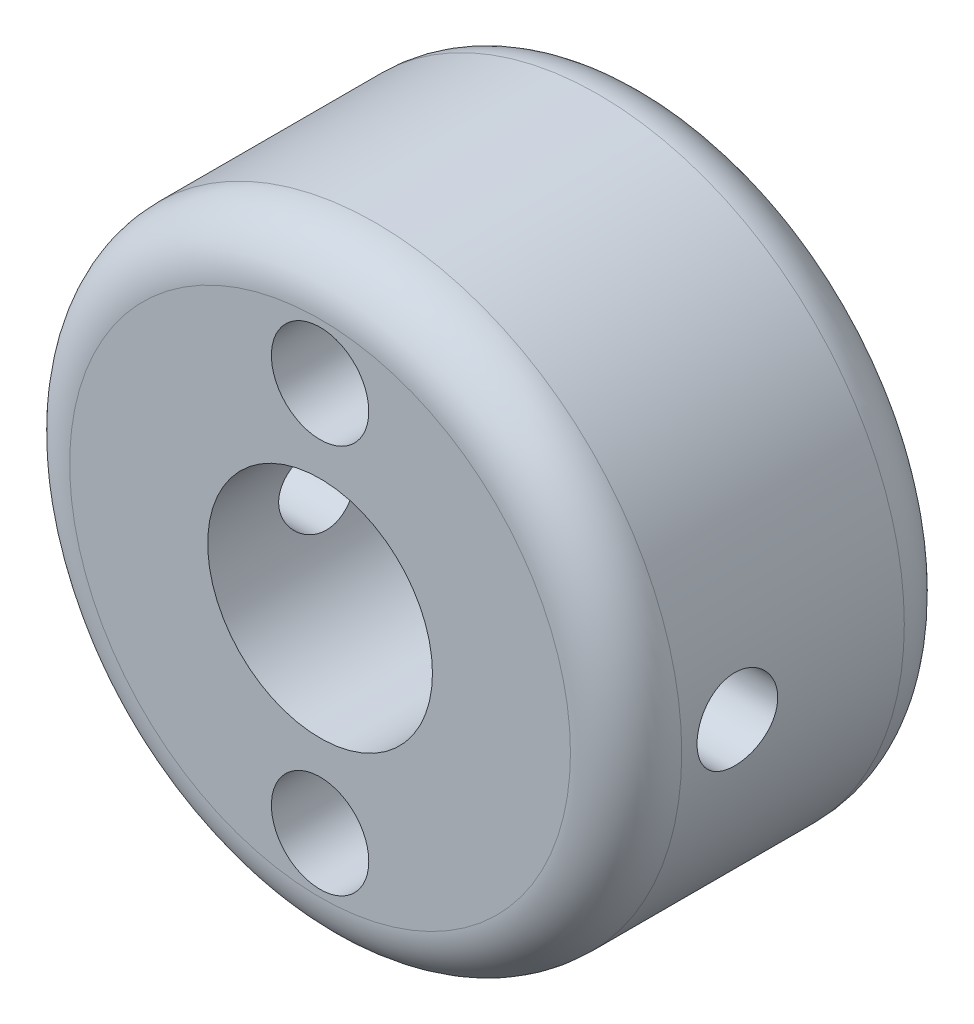
ISO-10303-21;
HEADER;
FILE_DESCRIPTION(('STEP AP214'),'2;1');
FILE_NAME('part.step','',(''),(''),'','','');
FILE_SCHEMA(('AUTOMOTIVE_DESIGN { 1 0 10303 214 1 1 1 1 }'));
ENDSEC;
DATA;
#1=APPLICATION_CONTEXT('core data for automotive mechanical design processes');
#2=APPLICATION_PROTOCOL_DEFINITION('international standard','automotive_design',2000,#1);
#3=PRODUCT_CONTEXT('',#1,'mechanical');
#4=PRODUCT('Part','Part','',(#3));
#5=PRODUCT_RELATED_PRODUCT_CATEGORY('part','',(#4));
#6=PRODUCT_DEFINITION_FORMATION('','',#4);
#7=PRODUCT_DEFINITION_CONTEXT('part definition',#1,'design');
#8=PRODUCT_DEFINITION('design','',#6,#7);
#9=PRODUCT_DEFINITION_SHAPE('','',#8);
#10=(LENGTH_UNIT() NAMED_UNIT(*) SI_UNIT(.MILLI.,.METRE.));
#11=(NAMED_UNIT(*) PLANE_ANGLE_UNIT() SI_UNIT($,.RADIAN.));
#12=(NAMED_UNIT(*) SI_UNIT($,.STERADIAN.) SOLID_ANGLE_UNIT());
#13=UNCERTAINTY_MEASURE_WITH_UNIT(LENGTH_MEASURE(1.E-05),#10,'distance_accuracy_value','');
#14=(GEOMETRIC_REPRESENTATION_CONTEXT(3) GLOBAL_UNCERTAINTY_ASSIGNED_CONTEXT((#13)) GLOBAL_UNIT_ASSIGNED_CONTEXT((#10,
#11,#12)) REPRESENTATION_CONTEXT('',''));
#15=CARTESIAN_POINT('',(0.,0.,0.));
#16=DIRECTION('',(0.,0.,1.));
#17=DIRECTION('',(1.,0.,0.));
#18=AXIS2_PLACEMENT_3D('',#15,#16,#17);
#19=CARTESIAN_POINT('',(0.,0.,12.));
#20=DIRECTION('',(0.,0.,-1.));
#21=DIRECTION('',(-1.,0.,0.));
#22=AXIS2_PLACEMENT_3D('',#19,#20,#21);
#23=CYLINDRICAL_SURFACE('',#22,11.);
#24=CARTESIAN_POINT('',(0.,0.,2.));
#25=DIRECTION('',(0.,0.,1.));
#26=DIRECTION('',(1.,0.,0.));
#27=AXIS2_PLACEMENT_3D('',#24,#25,#26);
#28=CIRCLE('',#27,11.);
#29=CARTESIAN_POINT('',(11.,0.,2.));
#30=VERTEX_POINT('',#29);
#31=EDGE_CURVE('E58',#30,#30,#28,.T.);
#32=ORIENTED_EDGE('',*,*,#31,.T.);
#33=EDGE_LOOP('',(#32));
#34=FACE_BOUND('',#33,.T.);
#35=CARTESIAN_POINT('',(0.,0.,10.));
#36=DIRECTION('',(0.,0.,1.));
#37=DIRECTION('',(1.,0.,0.));
#38=AXIS2_PLACEMENT_3D('',#35,#36,#37);
#39=CIRCLE('',#38,11.);
#40=CARTESIAN_POINT('',(11.,0.,10.));
#41=VERTEX_POINT('',#40);
#42=EDGE_CURVE('E63',#41,#41,#39,.F.);
#43=ORIENTED_EDGE('',*,*,#42,.T.);
#44=EDGE_LOOP('',(#43));
#45=FACE_BOUND('',#44,.T.);
#46=CARTESIAN_POINT('',(-11.,0.,6.55));
#47=CARTESIAN_POINT('',(-10.9999988196388,0.0810700646171393,6.55000342051961));
#48=CARTESIAN_POINT('',(-10.9990943229053,0.162189868877602,6.55682192032503));
#49=CARTESIAN_POINT('',(-10.9955731202661,0.322169605437502,6.58391315314188));
#50=CARTESIAN_POINT('',(-10.9929546573158,0.401027131913437,6.60419969300054));
#51=CARTESIAN_POINT('',(-10.9863003210212,0.554143323078767,6.65761671049998));
#52=CARTESIAN_POINT('',(-10.9822654320346,0.628405139545536,6.6907382699875));
#53=CARTESIAN_POINT('',(-10.9732262610622,0.770303018771588,6.76886501147568));
#54=CARTESIAN_POINT('',(-10.9682221372676,0.837940160051304,6.81386825467285));
#55=CARTESIAN_POINT('',(-10.9577685262702,0.965094397524424,6.91477387526258));
#56=CARTESIAN_POINT('',(-10.9523167626944,1.02456528084474,6.97073425703771));
#57=CARTESIAN_POINT('',(-10.9416005348791,1.13330064962176,7.09184100218557));
#58=CARTESIAN_POINT('',(-10.9363360804959,1.18256459863647,7.15698784806557));
#59=CARTESIAN_POINT('',(-10.9265682378684,1.26966190957159,7.29492131419906));
#60=CARTESIAN_POINT('',(-10.9220677857385,1.30745159484514,7.36773573969019));
#61=CARTESIAN_POINT('',(-10.9143678475705,1.37024869470427,7.51874678877762));
#62=CARTESIAN_POINT('',(-10.9111683067632,1.39525664741921,7.59694318562786));
#63=CARTESIAN_POINT('',(-10.9064543923123,1.43163912912521,7.75601702054221));
#64=CARTESIAN_POINT('',(-10.9049303392818,1.44309199636364,7.83687624962315));
#65=CARTESIAN_POINT('',(-10.9037104090596,1.45228167982049,7.99938226110222));
#66=CARTESIAN_POINT('',(-10.9040144503748,1.4500191074473,8.0810290082323));
#67=CARTESIAN_POINT('',(-10.9064074983364,1.43190636958793,8.24224456855266));
#68=CARTESIAN_POINT('',(-10.9084851368854,1.41614273874349,8.32182329681115));
#69=CARTESIAN_POINT('',(-10.9141735456992,1.37161048448269,8.47719608118436));
#70=CARTESIAN_POINT('',(-10.9177843501963,1.34284157068583,8.55299005275151));
#71=CARTESIAN_POINT('',(-10.9261450516096,1.27302315482551,8.69890922463832));
#72=CARTESIAN_POINT('',(-10.9308984051033,1.23193629190835,8.76901634265197));
#73=CARTESIAN_POINT('',(-10.9410059978065,1.1386749782748,8.90137349380902));
#74=CARTESIAN_POINT('',(-10.9463602675537,1.08649996395346,8.96362312730411));
#75=CARTESIAN_POINT('',(-10.9571168626766,0.972064992456455,9.0790003578433));
#76=CARTESIAN_POINT('',(-10.9625192406978,0.909730494064861,9.13205404548237));
#77=CARTESIAN_POINT('',(-10.9727248548317,0.777001989824109,9.22695708797897));
#78=CARTESIAN_POINT('',(-10.9775280892857,0.70660796166477,9.2688064118198));
#79=CARTESIAN_POINT('',(-10.9859976882221,0.559699827335735,9.34011378323897));
#80=CARTESIAN_POINT('',(-10.9896636028473,0.483183314483563,9.36956692925241));
#81=CARTESIAN_POINT('',(-10.9954415298472,0.326231477719914,9.41518578764115));
#82=CARTESIAN_POINT('',(-10.997553623177,0.245796358202938,9.43135219226844));
#83=CARTESIAN_POINT('',(-10.9999753597285,0.0839293214855447,9.44984223716992));
#84=CARTESIAN_POINT('',(-11.0002982527661,0.0025092190009183,9.45226763863529));
#85=CARTESIAN_POINT('',(-10.9991410564284,-0.159576341881272,9.44347577522623));
#86=CARTESIAN_POINT('',(-10.9976610098596,-0.240241818149795,9.43225883425634));
#87=CARTESIAN_POINT('',(-10.9930724672379,-0.398226029883761,9.39658525683905));
#88=CARTESIAN_POINT('',(-10.9899699737374,-0.475555971843567,9.37217741160519));
#89=CARTESIAN_POINT('',(-10.9824837081492,-0.625025328682233,9.31086578614261));
#90=CARTESIAN_POINT('',(-10.9780998881678,-0.697164549415324,9.27396153881192));
#91=CARTESIAN_POINT('',(-10.9685062679801,-0.834657390373671,9.18846039037535));
#92=CARTESIAN_POINT('',(-10.9632918985135,-0.899969953544018,9.13979798782221));
#93=CARTESIAN_POINT('',(-10.9526340584351,-1.02153712511859,9.03225416318574));
#94=CARTESIAN_POINT('',(-10.9471905776756,-1.07779133177993,8.97337228810392));
#95=CARTESIAN_POINT('',(-10.9366468548114,-1.1800083558422,8.84661145626795));
#96=CARTESIAN_POINT('',(-10.9315490130966,-1.22590351912656,8.77867771571363));
#97=CARTESIAN_POINT('',(-10.9223140367197,-1.30563155012618,8.63600606279097));
#98=CARTESIAN_POINT('',(-10.9181768810082,-1.33946468213883,8.56126829955414));
#99=CARTESIAN_POINT('',(-10.9113483388595,-1.39399990531041,8.40732418761388));
#100=CARTESIAN_POINT('',(-10.9086528277334,-1.41473948946965,8.3281313117656));
#101=CARTESIAN_POINT('',(-10.9050011700211,-1.44261930498135,8.16734898032797));
#102=CARTESIAN_POINT('',(-10.9040449326706,-1.44976024598175,8.08575965002372));
#103=CARTESIAN_POINT('',(-10.9039829338122,-1.45022606159318,7.92317378599637));
#104=CARTESIAN_POINT('',(-10.9048629343521,-1.4436572398525,7.84217754184687));
#105=CARTESIAN_POINT('',(-10.9083435624851,-1.41711579165026,7.6824513797019));
#106=CARTESIAN_POINT('',(-10.9109441895948,-1.39714316895594,7.60372146106946));
#107=CARTESIAN_POINT('',(-10.9175684950974,-1.34439544632631,7.4507807749069));
#108=CARTESIAN_POINT('',(-10.9215915378437,-1.31162606430288,7.37656800609609));
#109=CARTESIAN_POINT('',(-10.9306083506385,-1.23422547164092,7.23467717142674));
#110=CARTESIAN_POINT('',(-10.9356021382087,-1.18959404689068,7.1669992235528));
#111=CARTESIAN_POINT('',(-10.9460440978656,-1.08934387085847,7.03955651235548));
#112=CARTESIAN_POINT('',(-10.9514953687448,-1.03364599113853,6.97985424254895));
#113=CARTESIAN_POINT('',(-10.96221108401,-0.913009987436894,6.87060382925458));
#114=CARTESIAN_POINT('',(-10.9674754842283,-0.848069696902254,6.82105807326282));
#115=CARTESIAN_POINT('',(-10.9772491210592,-0.710475153456872,6.7333462763053));
#116=CARTESIAN_POINT('',(-10.9817550751133,-0.637789486027496,6.69522916983561));
#117=CARTESIAN_POINT('',(-10.9894712322809,-0.48702809962841,6.63179768741467));
#118=CARTESIAN_POINT('',(-10.992682825891,-0.408958270914869,6.60646956516244));
#119=CARTESIAN_POINT('',(-10.9966846065157,-0.275414672613428,6.57531766397778));
#120=CARTESIAN_POINT('',(-10.9979217393459,-0.220778830682095,6.56583740166495));
#121=CARTESIAN_POINT('',(-10.9995798358821,-0.110769729790444,6.55317742793763));
#122=CARTESIAN_POINT('',(-11.0000008065597,-0.0553964771331876,6.54999766270402));
#123=CARTESIAN_POINT('',(-11.,0.,6.55));
#124=B_SPLINE_CURVE_WITH_KNOTS('',3,(#46,#47,#48,#49,#50,#51,#52,#53,#54,#55,#56,#57,#58,#59,
#60,#61,#62,#63,#64,#65,#66,#67,#68,#69,#70,#71,#72,#73,#74,#75,#76,#77,#78,#79,#80,#81,#82,#83,
#84,#85,#86,#87,#88,#89,#90,#91,#92,#93,#94,#95,#96,#97,#98,#99,#100,#101,#102,#103,#104,#105,
#106,#107,#108,#109,#110,#111,#112,#113,#114,#115,#116,#117,#118,#119,#120,#121,#122,#123),
.UNSPECIFIED.,.T.,.F.,(4,2,2,2,2,2,2,2,2,2,2,2,2,2,2,2,2,2,2,2,2,2,2,2,2,2,2,2,2,2,2,2,2,2,2,2,
2,2,4),(0.,0.243007828473049,0.4862651634519,0.729353778194148,0.972402751241188,
1.21677495909267,1.46116000706599,1.70646396695275,1.95175759833839,2.19562658431033,
2.43948469914337,2.68179141020091,2.92410353172262,3.16715816197606,3.41022514952563,
3.65516324515727,3.90010201883658,4.14513755281857,4.39016031940414,4.63336613485026,
4.87656617607309,5.1188727521352,5.3611883863547,5.60488634486559,5.84859510853436,
6.09385220859557,6.33910393437143,6.58365016502282,6.82818363362987,7.07082806913886,
7.31347243645079,7.55600850802209,7.79854895770433,8.04289046043343,8.28728933492577,
8.53272018932119,8.77788667661282,8.94393924693374,9.10999039882029),.UNSPECIFIED.);
#125=CARTESIAN_POINT('',(-11.,0.,6.55));
#126=VERTEX_POINT('',#125);
#127=EDGE_CURVE('E106',#126,#126,#124,.T.);
#128=ORIENTED_EDGE('',*,*,#127,.T.);
#129=EDGE_LOOP('',(#128));
#130=FACE_BOUND('',#129,.T.);
#131=CARTESIAN_POINT('',(11.,0.,6.55));
#132=CARTESIAN_POINT('',(10.9999988196388,-0.0810700646171393,6.55000342051961));
#133=CARTESIAN_POINT('',(10.9990943229053,-0.162189868877602,6.55682192032503));
#134=CARTESIAN_POINT('',(10.9955731202661,-0.322169605437502,6.58391315314188));
#135=CARTESIAN_POINT('',(10.9929546573158,-0.401027131913437,6.60419969300054));
#136=CARTESIAN_POINT('',(10.9863003210212,-0.554143323078767,6.65761671049998));
#137=CARTESIAN_POINT('',(10.9822654320346,-0.628405139545536,6.6907382699875));
#138=CARTESIAN_POINT('',(10.9732262610622,-0.770303018771588,6.76886501147568));
#139=CARTESIAN_POINT('',(10.9682221372676,-0.837940160051304,6.81386825467285));
#140=CARTESIAN_POINT('',(10.9577685262702,-0.965094397524424,6.91477387526258));
#141=CARTESIAN_POINT('',(10.9523167626944,-1.02456528084474,6.97073425703771));
#142=CARTESIAN_POINT('',(10.9416005348791,-1.13330064962176,7.09184100218557));
#143=CARTESIAN_POINT('',(10.9363360804959,-1.18256459863647,7.15698784806557));
#144=CARTESIAN_POINT('',(10.9265682378684,-1.26966190957159,7.29492131419906));
#145=CARTESIAN_POINT('',(10.9220677857385,-1.30745159484514,7.36773573969019));
#146=CARTESIAN_POINT('',(10.9143678475705,-1.37024869470427,7.51874678877762));
#147=CARTESIAN_POINT('',(10.9111683067632,-1.39525664741921,7.59694318562786));
#148=CARTESIAN_POINT('',(10.9064543923123,-1.43163912912521,7.75601702054221));
#149=CARTESIAN_POINT('',(10.9049303392818,-1.44309199636364,7.83687624962315));
#150=CARTESIAN_POINT('',(10.9037104090596,-1.45228167982049,7.99938226110222));
#151=CARTESIAN_POINT('',(10.9040144503748,-1.4500191074473,8.0810290082323));
#152=CARTESIAN_POINT('',(10.9064074983364,-1.43190636958793,8.24224456855266));
#153=CARTESIAN_POINT('',(10.9084851368854,-1.41614273874349,8.32182329681115));
#154=CARTESIAN_POINT('',(10.9141735456992,-1.37161048448269,8.47719608118436));
#155=CARTESIAN_POINT('',(10.9177843501963,-1.34284157068583,8.55299005275151));
#156=CARTESIAN_POINT('',(10.9261450516096,-1.27302315482551,8.69890922463832));
#157=CARTESIAN_POINT('',(10.9308984051033,-1.23193629190835,8.76901634265197));
#158=CARTESIAN_POINT('',(10.9410059978065,-1.1386749782748,8.90137349380902));
#159=CARTESIAN_POINT('',(10.9463602675537,-1.08649996395346,8.96362312730411));
#160=CARTESIAN_POINT('',(10.9571168626766,-0.972064992456455,9.0790003578433));
#161=CARTESIAN_POINT('',(10.9625192406978,-0.909730494064861,9.13205404548237));
#162=CARTESIAN_POINT('',(10.9727248548317,-0.777001989824109,9.22695708797897));
#163=CARTESIAN_POINT('',(10.9775280892857,-0.70660796166477,9.2688064118198));
#164=CARTESIAN_POINT('',(10.9859976882221,-0.559699827335735,9.34011378323897));
#165=CARTESIAN_POINT('',(10.9896636028473,-0.483183314483563,9.36956692925241));
#166=CARTESIAN_POINT('',(10.9954415298472,-0.326231477719914,9.41518578764115));
#167=CARTESIAN_POINT('',(10.997553623177,-0.245796358202938,9.43135219226844));
#168=CARTESIAN_POINT('',(10.9999753597285,-0.0839293214855447,9.44984223716992));
#169=CARTESIAN_POINT('',(11.0002982527661,-0.0025092190009183,9.45226763863529));
#170=CARTESIAN_POINT('',(10.9991410564284,0.159576341881272,9.44347577522623));
#171=CARTESIAN_POINT('',(10.9976610098596,0.240241818149795,9.43225883425634));
#172=CARTESIAN_POINT('',(10.9930724672379,0.398226029883761,9.39658525683905));
#173=CARTESIAN_POINT('',(10.9899699737374,0.475555971843567,9.37217741160519));
#174=CARTESIAN_POINT('',(10.9824837081492,0.625025328682233,9.31086578614261));
#175=CARTESIAN_POINT('',(10.9780998881678,0.697164549415324,9.27396153881192));
#176=CARTESIAN_POINT('',(10.9685062679801,0.834657390373671,9.18846039037535));
#177=CARTESIAN_POINT('',(10.9632918985135,0.899969953544018,9.13979798782221));
#178=CARTESIAN_POINT('',(10.9526340584351,1.02153712511859,9.03225416318574));
#179=CARTESIAN_POINT('',(10.9471905776756,1.07779133177993,8.97337228810392));
#180=CARTESIAN_POINT('',(10.9366468548114,1.1800083558422,8.84661145626795));
#181=CARTESIAN_POINT('',(10.9315490130966,1.22590351912656,8.77867771571363));
#182=CARTESIAN_POINT('',(10.9223140367197,1.30563155012618,8.63600606279097));
#183=CARTESIAN_POINT('',(10.9181768810082,1.33946468213883,8.56126829955414));
#184=CARTESIAN_POINT('',(10.9113483388595,1.39399990531041,8.40732418761388));
#185=CARTESIAN_POINT('',(10.9086528277334,1.41473948946965,8.3281313117656));
#186=CARTESIAN_POINT('',(10.9050011700211,1.44261930498135,8.16734898032797));
#187=CARTESIAN_POINT('',(10.9040449326706,1.44976024598175,8.08575965002372));
#188=CARTESIAN_POINT('',(10.9039829338122,1.45022606159318,7.92317378599637));
#189=CARTESIAN_POINT('',(10.9048629343521,1.4436572398525,7.84217754184687));
#190=CARTESIAN_POINT('',(10.9083435624851,1.41711579165026,7.6824513797019));
#191=CARTESIAN_POINT('',(10.9109441895948,1.39714316895594,7.60372146106946));
#192=CARTESIAN_POINT('',(10.9175684950974,1.34439544632631,7.4507807749069));
#193=CARTESIAN_POINT('',(10.9215915378437,1.31162606430288,7.37656800609609));
#194=CARTESIAN_POINT('',(10.9306083506385,1.23422547164092,7.23467717142674));
#195=CARTESIAN_POINT('',(10.9356021382087,1.18959404689068,7.1669992235528));
#196=CARTESIAN_POINT('',(10.9460440978656,1.08934387085847,7.03955651235548));
#197=CARTESIAN_POINT('',(10.9514953687448,1.03364599113853,6.97985424254895));
#198=CARTESIAN_POINT('',(10.96221108401,0.913009987436894,6.87060382925458));
#199=CARTESIAN_POINT('',(10.9674754842283,0.848069696902254,6.82105807326282));
#200=CARTESIAN_POINT('',(10.9772491210592,0.710475153456872,6.7333462763053));
#201=CARTESIAN_POINT('',(10.9817550751133,0.637789486027496,6.69522916983561));
#202=CARTESIAN_POINT('',(10.9894712322809,0.48702809962841,6.63179768741467));
#203=CARTESIAN_POINT('',(10.992682825891,0.408958270914869,6.60646956516244));
#204=CARTESIAN_POINT('',(10.9966846065157,0.275414672613428,6.57531766397778));
#205=CARTESIAN_POINT('',(10.9979217393459,0.220778830682095,6.56583740166495));
#206=CARTESIAN_POINT('',(10.9995798358821,0.110769729790444,6.55317742793763));
#207=CARTESIAN_POINT('',(11.0000008065597,0.0553964771331876,6.54999766270402));
#208=CARTESIAN_POINT('',(11.,0.,6.55));
#209=B_SPLINE_CURVE_WITH_KNOTS('',3,(#131,#132,#133,#134,#135,#136,#137,#138,#139,#140,#141,
#142,#143,#144,#145,#146,#147,#148,#149,#150,#151,#152,#153,#154,#155,#156,#157,#158,#159,#160,
#161,#162,#163,#164,#165,#166,#167,#168,#169,#170,#171,#172,#173,#174,#175,#176,#177,#178,#179,
#180,#181,#182,#183,#184,#185,#186,#187,#188,#189,#190,#191,#192,#193,#194,#195,#196,#197,#198,
#199,#200,#201,#202,#203,#204,#205,#206,#207,#208),.UNSPECIFIED.,.T.,.F.,(4,2,2,2,2,2,2,2,2,2,2,
2,2,2,2,2,2,2,2,2,2,2,2,2,2,2,2,2,2,2,2,2,2,2,2,2,2,2,4),(0.,0.243007828473049,0.4862651634519,
0.729353778194148,0.972402751241188,1.21677495909267,1.46116000706599,1.70646396695275,
1.95175759833839,2.19562658431033,2.43948469914337,2.68179141020091,2.92410353172262,
3.16715816197606,3.41022514952563,3.65516324515727,3.90010201883658,4.14513755281857,
4.39016031940414,4.63336613485026,4.87656617607309,5.1188727521352,5.3611883863547,
5.60488634486559,5.84859510853436,6.09385220859557,6.33910393437143,6.58365016502282,
6.82818363362987,7.07082806913886,7.31347243645079,7.55600850802209,7.79854895770433,
8.04289046043343,8.28728933492577,8.53272018932119,8.77788667661282,8.94393924693374,
9.10999039882029),.UNSPECIFIED.);
#210=CARTESIAN_POINT('',(11.,0.,6.55));
#211=VERTEX_POINT('',#210);
#212=EDGE_CURVE('E79',#211,#211,#209,.T.);
#213=ORIENTED_EDGE('',*,*,#212,.T.);
#214=EDGE_LOOP('',(#213));
#215=FACE_BOUND('',#214,.T.);
#216=ADVANCED_FACE('F45',(#34,#45,#130,#215),#23,.T.);
#217=CARTESIAN_POINT('',(0.,0.,12.));
#218=DIRECTION('',(0.,0.,1.));
#219=DIRECTION('',(1.,0.,0.));
#220=AXIS2_PLACEMENT_3D('',#217,#218,#219);
#221=PLANE('',#220);
#222=CARTESIAN_POINT('',(0.,0.,12.));
#223=DIRECTION('',(0.,0.,1.));
#224=DIRECTION('',(1.,0.,0.));
#225=AXIS2_PLACEMENT_3D('',#222,#223,#224);
#226=CIRCLE('',#225,9.);
#227=CARTESIAN_POINT('',(9.,0.,12.));
#228=VERTEX_POINT('',#227);
#229=EDGE_CURVE('E11',#228,#228,#226,.T.);
#230=ORIENTED_EDGE('',*,*,#229,.T.);
#231=EDGE_LOOP('',(#230));
#232=FACE_BOUND('',#231,.T.);
#233=CARTESIAN_POINT('',(0.,0.,12.));
#234=DIRECTION('',(0.,0.,1.));
#235=DIRECTION('',(1.,0.,0.));
#236=AXIS2_PLACEMENT_3D('',#233,#234,#235);
#237=CIRCLE('',#236,4.04);
#238=CARTESIAN_POINT('',(4.04,0.,12.));
#239=VERTEX_POINT('',#238);
#240=EDGE_CURVE('E141',#239,#239,#237,.T.);
#241=ORIENTED_EDGE('',*,*,#240,.F.);
#242=EDGE_LOOP('',(#241));
#243=FACE_BOUND('',#242,.T.);
#244=CARTESIAN_POINT('',(0.,7.,12.));
#245=DIRECTION('',(0.,0.,1.));
#246=DIRECTION('',(1.,0.,0.));
#247=AXIS2_PLACEMENT_3D('',#244,#245,#246);
#248=CIRCLE('',#247,1.75);
#249=CARTESIAN_POINT('',(1.75,7.,12.));
#250=VERTEX_POINT('',#249);
#251=EDGE_CURVE('E155',#250,#250,#248,.T.);
#252=ORIENTED_EDGE('',*,*,#251,.F.);
#253=EDGE_LOOP('',(#252));
#254=FACE_BOUND('',#253,.T.);
#255=CARTESIAN_POINT('',(0.,-7.,12.));
#256=DIRECTION('',(0.,0.,1.));
#257=DIRECTION('',(1.,0.,0.));
#258=AXIS2_PLACEMENT_3D('',#255,#256,#257);
#259=CIRCLE('',#258,1.75);
#260=CARTESIAN_POINT('',(1.75,-7.,12.));
#261=VERTEX_POINT('',#260);
#262=EDGE_CURVE('E149',#261,#261,#259,.T.);
#263=ORIENTED_EDGE('',*,*,#262,.F.);
#264=EDGE_LOOP('',(#263));
#265=FACE_BOUND('',#264,.T.);
#266=ADVANCED_FACE('F114',(#232,#243,#254,#265),#221,.T.);
#267=CARTESIAN_POINT('',(0.,0.,0.));
#268=DIRECTION('',(0.,0.,1.));
#269=DIRECTION('',(1.,0.,0.));
#270=AXIS2_PLACEMENT_3D('',#267,#268,#269);
#271=PLANE('',#270);
#272=CARTESIAN_POINT('',(0.,0.,0.));
#273=DIRECTION('',(0.,0.,1.));
#274=DIRECTION('',(1.,0.,0.));
#275=AXIS2_PLACEMENT_3D('',#272,#273,#274);
#276=CIRCLE('',#275,9.);
#277=CARTESIAN_POINT('',(9.,0.,0.));
#278=VERTEX_POINT('',#277);
#279=EDGE_CURVE('E53',#278,#278,#276,.F.);
#280=ORIENTED_EDGE('',*,*,#279,.T.);
#281=EDGE_LOOP('',(#280));
#282=FACE_BOUND('',#281,.T.);
#283=CARTESIAN_POINT('',(0.,7.,0.));
#284=DIRECTION('',(0.,0.,1.));
#285=DIRECTION('',(1.,0.,0.));
#286=AXIS2_PLACEMENT_3D('',#283,#284,#285);
#287=CIRCLE('',#286,1.75);
#288=CARTESIAN_POINT('',(1.75,7.,0.));
#289=VERTEX_POINT('',#288);
#290=EDGE_CURVE('E69',#289,#289,#287,.T.);
#291=ORIENTED_EDGE('',*,*,#290,.T.);
#292=EDGE_LOOP('',(#291));
#293=FACE_BOUND('',#292,.T.);
#294=CARTESIAN_POINT('',(0.,-7.,0.));
#295=DIRECTION('',(0.,0.,1.));
#296=DIRECTION('',(1.,0.,0.));
#297=AXIS2_PLACEMENT_3D('',#294,#295,#296);
#298=CIRCLE('',#297,1.75);
#299=CARTESIAN_POINT('',(1.75,-7.,0.));
#300=VERTEX_POINT('',#299);
#301=EDGE_CURVE('E159',#300,#300,#298,.T.);
#302=ORIENTED_EDGE('',*,*,#301,.T.);
#303=EDGE_LOOP('',(#302));
#304=FACE_BOUND('',#303,.T.);
#305=ADVANCED_FACE('F116',(#282,#293,#304),#271,.F.);
#306=CARTESIAN_POINT('',(0.,-7.,0.));
#307=DIRECTION('',(0.,0.,1.));
#308=DIRECTION('',(1.,0.,0.));
#309=AXIS2_PLACEMENT_3D('',#306,#307,#308);
#310=CYLINDRICAL_SURFACE('',#309,1.75);
#311=ORIENTED_EDGE('',*,*,#301,.F.);
#312=EDGE_LOOP('',(#311));
#313=FACE_BOUND('',#312,.T.);
#314=ORIENTED_EDGE('',*,*,#262,.T.);
#315=EDGE_LOOP('',(#314));
#316=FACE_BOUND('',#315,.T.);
#317=ADVANCED_FACE('F166',(#313,#316),#310,.F.);
#318=CARTESIAN_POINT('',(0.,7.,0.));
#319=DIRECTION('',(0.,0.,1.));
#320=DIRECTION('',(1.,0.,0.));
#321=AXIS2_PLACEMENT_3D('',#318,#319,#320);
#322=CYLINDRICAL_SURFACE('',#321,1.75);
#323=ORIENTED_EDGE('',*,*,#290,.F.);
#324=EDGE_LOOP('',(#323));
#325=FACE_BOUND('',#324,.T.);
#326=ORIENTED_EDGE('',*,*,#251,.T.);
#327=EDGE_LOOP('',(#326));
#328=FACE_BOUND('',#327,.T.);
#329=ADVANCED_FACE('F174',(#325,#328),#322,.F.);
#330=CARTESIAN_POINT('',(0.,0.,-11.4268455839746));
#331=DIRECTION('',(0.,0.,1.));
#332=DIRECTION('',(1.,0.,0.));
#333=AXIS2_PLACEMENT_3D('',#330,#331,#332);
#334=CYLINDRICAL_SURFACE('',#333,4.04);
#335=CARTESIAN_POINT('',(4.04,0.,6.55));
#336=CARTESIAN_POINT('',(4.04000126016037,0.0787618064502002,6.54999825526379));
#337=CARTESIAN_POINT('',(4.03767621568689,0.157511230115755,6.55643775404281));
#338=CARTESIAN_POINT('',(4.02863209965387,0.312669758702196,6.58193162027256));
#339=CARTESIAN_POINT('',(4.02191324213401,0.389078977433743,6.60098537323462));
#340=CARTESIAN_POINT('',(4.00480627736836,0.537297699984576,6.65095599201179));
#341=CARTESIAN_POINT('',(3.99442488070304,0.609115334226105,6.6818511706048));
#342=CARTESIAN_POINT('',(3.97103690516046,0.746546327770634,6.75452220681982));
#343=CARTESIAN_POINT('',(3.95802968972146,0.812158176966921,6.79630070353501));
#344=CARTESIAN_POINT('',(3.93017044364269,0.937900093065517,6.89127554133928));
#345=CARTESIAN_POINT('',(3.91526929853665,0.997752694630992,6.94482471015873));
#346=CARTESIAN_POINT('',(3.88555436002047,1.10784704219212,7.06107154390154));
#347=CARTESIAN_POINT('',(3.87074059123115,1.15808619399177,7.12377167019366));
#348=CARTESIAN_POINT('',(3.84231885236823,1.24921873078274,7.25916606970874));
#349=CARTESIAN_POINT('',(3.82876962154214,1.28973272588499,7.33212925333304));
#350=CARTESIAN_POINT('',(3.80516832515432,1.35779280331349,7.48439764736045));
#351=CARTESIAN_POINT('',(3.79511499614941,1.38534357191355,7.56370055377311));
#352=CARTESIAN_POINT('',(3.78016566727027,1.42562124336376,7.72321659887593));
#353=CARTESIAN_POINT('',(3.77508735935818,1.43887412279942,7.80327929507017));
#354=CARTESIAN_POINT('',(3.77012708968122,1.45182456687305,7.96464078461739));
#355=CARTESIAN_POINT('',(3.77024320684197,1.45152714287153,8.04593910987298));
#356=CARTESIAN_POINT('',(3.77550044269156,1.43779003961182,8.20278722583972));
#357=CARTESIAN_POINT('',(3.78036944585565,1.42506202572646,8.27841011403379));
#358=CARTESIAN_POINT('',(3.79413438379113,1.38799534105434,8.42636520604161));
#359=CARTESIAN_POINT('',(3.803030874003,1.36365506876799,8.49869695445157));
#360=CARTESIAN_POINT('',(3.82402392138685,1.30363480116992,8.63953266438433));
#361=CARTESIAN_POINT('',(3.83617482571113,1.26775992709895,8.70794511863215));
#362=CARTESIAN_POINT('',(3.86228763596605,1.18582433350594,8.83799287453004));
#363=CARTESIAN_POINT('',(3.87625012797586,1.1397603142096,8.8996259709682));
#364=CARTESIAN_POINT('',(3.90545541430085,1.03543357662181,9.01832952928804));
#365=CARTESIAN_POINT('',(3.92072428826204,0.976597147208566,9.07489050363435));
#366=CARTESIAN_POINT('',(3.95008282299265,0.850092595515183,9.17748703664146));
#367=CARTESIAN_POINT('',(3.96417233155293,0.782423336143702,9.22352123803843));
#368=CARTESIAN_POINT('',(3.9898243577068,0.638962384139161,9.30425717169918));
#369=CARTESIAN_POINT('',(4.00135135066376,0.563075893436374,9.33880253503134));
#370=CARTESIAN_POINT('',(4.02031859574319,0.406053242907525,9.39447182415423));
#371=CARTESIAN_POINT('',(4.02776050418716,0.324919225659561,9.41560119008518));
#372=CARTESIAN_POINT('',(4.03743457792305,0.164002711521846,9.44289005908764));
#373=CARTESIAN_POINT('',(4.03990560783059,0.0843509461573468,9.44973654345393));
#374=CARTESIAN_POINT('',(4.04008897173708,-0.0749916804897599,9.45024835397396));
#375=CARTESIAN_POINT('',(4.03780225738151,-0.154682530767036,9.44391631609968));
#376=CARTESIAN_POINT('',(4.02888492827857,-0.308960280101032,9.41878216958733));
#377=CARTESIAN_POINT('',(4.02240721866505,-0.383628385087834,9.4004187291681));
#378=CARTESIAN_POINT('',(4.0059120138421,-0.528780680394339,9.35230895403505));
#379=CARTESIAN_POINT('',(3.99589405876813,-0.599264325778627,9.32256114049247));
#380=CARTESIAN_POINT('',(3.97296565354375,-0.736280083515787,9.25160393702934));
#381=CARTESIAN_POINT('',(3.95998128690512,-0.802643637159502,9.21009366376336));
#382=CARTESIAN_POINT('',(3.93257169984643,-0.927676378382618,9.11713486964022));
#383=CARTESIAN_POINT('',(3.91814598208101,-0.98634289379671,9.0656829125969));
#384=CARTESIAN_POINT('',(3.88850127503977,-1.09756395882141,8.95108406966142));
#385=CARTESIAN_POINT('',(3.87328078434202,-1.14962944287525,8.8874617105145));
#386=CARTESIAN_POINT('',(3.84452103506034,-1.24242721975802,8.75207021130897));
#387=CARTESIAN_POINT('',(3.83098186467984,-1.28315891814628,8.68030064421893));
#388=CARTESIAN_POINT('',(3.80721035279256,-1.35206776509922,8.53031090809236));
#389=CARTESIAN_POINT('',(3.79698246895595,-1.38022800906331,8.45208221998432));
#390=CARTESIAN_POINT('',(3.78123362319485,-1.4228133479885,8.29153001743053));
#391=CARTESIAN_POINT('',(3.77571007682397,-1.43724598506614,8.20920877767559));
#392=CARTESIAN_POINT('',(3.77031947363925,-1.45132433674863,8.04805664784078));
#393=CARTESIAN_POINT('',(3.77013685895988,-1.45179499119274,7.96930770007073));
#394=CARTESIAN_POINT('',(3.77465115219163,-1.44001652875798,7.81291688056103));
#395=CARTESIAN_POINT('',(3.77934767293819,-1.42776842112637,7.73527492147621));
#396=CARTESIAN_POINT('',(3.79283890100701,-1.39152069811059,7.58530427347494));
#397=CARTESIAN_POINT('',(3.80152568785658,-1.36782974562986,7.51289047019824));
#398=CARTESIAN_POINT('',(3.82196449888695,-1.30963124817088,7.37301679204182));
#399=CARTESIAN_POINT('',(3.83371726444256,-1.27512108662543,7.30555812041025));
#400=CARTESIAN_POINT('',(3.85968239415816,-1.19429287400981,7.17391289105934));
#401=CARTESIAN_POINT('',(3.87398719298508,-1.14747823972035,7.1100496397915));
#402=CARTESIAN_POINT('',(3.90310057477395,-1.04416631417108,6.99082051961624));
#403=CARTESIAN_POINT('',(3.91790930973825,-0.987666080317357,6.9354572428148));
#404=CARTESIAN_POINT('',(3.94721324158871,-0.863348622411333,6.8321094412848));
#405=CARTESIAN_POINT('',(3.96165951383767,-0.795119191913535,6.78460486384305));
#406=CARTESIAN_POINT('',(3.98785081851731,-0.651146854463182,6.70176936380318));
#407=CARTESIAN_POINT('',(3.9995960162624,-0.575404407737644,6.666437696118));
#408=CARTESIAN_POINT('',(4.01912081084875,-0.417863285637728,6.6089669814033));
#409=CARTESIAN_POINT('',(4.02686803447288,-0.336021128467091,6.58693539445486));
#410=CARTESIAN_POINT('',(4.03730593987129,-0.16944709230695,6.55745575924876));
#411=CARTESIAN_POINT('',(4.03999864456856,-0.0847163832054504,6.55000187664235));
#412=CARTESIAN_POINT('',(4.04,0.,6.55));
#413=B_SPLINE_CURVE_WITH_KNOTS('',3,(#335,#336,#337,#338,#339,#340,#341,#342,#343,#344,#345,
#346,#347,#348,#349,#350,#351,#352,#353,#354,#355,#356,#357,#358,#359,#360,#361,#362,#363,#364,
#365,#366,#367,#368,#369,#370,#371,#372,#373,#374,#375,#376,#377,#378,#379,#380,#381,#382,#383,
#384,#385,#386,#387,#388,#389,#390,#391,#392,#393,#394,#395,#396,#397,#398,#399,#400,#401,#402,
#403,#404,#405,#406,#407,#408,#409,#410,#411,#412),.UNSPECIFIED.,.T.,.F.,(4,2,2,2,2,2,2,2,2,2,2,
2,2,2,2,2,2,2,2,2,2,2,2,2,2,2,2,2,2,2,2,2,2,2,2,2,2,2,4),(0.,0.235973219180004,
0.471934944045828,0.707466561201842,0.943055345614458,1.18701159099683,1.43103357558793,
1.68342025320777,1.93571562149761,2.17837512968069,2.42094489489896,2.6503953392428,
2.87987743729722,3.11346061400516,3.34711954811773,3.59506704288841,3.84304648863364,
4.09427473520987,4.34540104443859,4.5841405558909,4.82283231918344,5.05327231313469,
5.28374225138072,5.52074263246625,5.75782507599913,6.00747937019061,6.25714675592174,
6.50714886088643,6.75701353213574,6.99208363124471,7.22713507871733,7.45617305655202,
7.68526646876861,7.92560872906477,8.16602413786776,8.41794556682776,8.66985157328278,
8.92376656337963,9.17757990976239),.UNSPECIFIED.);
#414=CARTESIAN_POINT('',(4.04,0.,6.55));
#415=VERTEX_POINT('',#414);
#416=EDGE_CURVE('E70',#415,#415,#413,.T.);
#417=ORIENTED_EDGE('',*,*,#416,.T.);
#418=EDGE_LOOP('',(#417));
#419=FACE_BOUND('',#418,.T.);
#420=CARTESIAN_POINT('',(-4.04,0.,6.55));
#421=CARTESIAN_POINT('',(-4.04000126016037,-0.0787618064502002,6.54999825526379));
#422=CARTESIAN_POINT('',(-4.03767621568689,-0.157511230115755,6.55643775404281));
#423=CARTESIAN_POINT('',(-4.02863209965387,-0.312669758702196,6.58193162027256));
#424=CARTESIAN_POINT('',(-4.02191324213401,-0.389078977433743,6.60098537323462));
#425=CARTESIAN_POINT('',(-4.00480627736836,-0.537297699984576,6.65095599201179));
#426=CARTESIAN_POINT('',(-3.99442488070304,-0.609115334226105,6.6818511706048));
#427=CARTESIAN_POINT('',(-3.97103690516046,-0.746546327770634,6.75452220681982));
#428=CARTESIAN_POINT('',(-3.95802968972146,-0.812158176966921,6.79630070353501));
#429=CARTESIAN_POINT('',(-3.93017044364269,-0.937900093065517,6.89127554133928));
#430=CARTESIAN_POINT('',(-3.91526929853665,-0.997752694630992,6.94482471015873));
#431=CARTESIAN_POINT('',(-3.88555436002047,-1.10784704219212,7.06107154390154));
#432=CARTESIAN_POINT('',(-3.87074059123115,-1.15808619399177,7.12377167019366));
#433=CARTESIAN_POINT('',(-3.84231885236823,-1.24921873078274,7.25916606970874));
#434=CARTESIAN_POINT('',(-3.82876962154214,-1.28973272588499,7.33212925333304));
#435=CARTESIAN_POINT('',(-3.80516832515432,-1.35779280331349,7.48439764736045));
#436=CARTESIAN_POINT('',(-3.79511499614941,-1.38534357191355,7.56370055377311));
#437=CARTESIAN_POINT('',(-3.78016566727027,-1.42562124336376,7.72321659887593));
#438=CARTESIAN_POINT('',(-3.77508735935818,-1.43887412279942,7.80327929507017));
#439=CARTESIAN_POINT('',(-3.77012708968122,-1.45182456687305,7.96464078461739));
#440=CARTESIAN_POINT('',(-3.77024320684197,-1.45152714287153,8.04593910987298));
#441=CARTESIAN_POINT('',(-3.77550044269156,-1.43779003961182,8.20278722583972));
#442=CARTESIAN_POINT('',(-3.78036944585565,-1.42506202572646,8.27841011403379));
#443=CARTESIAN_POINT('',(-3.79413438379113,-1.38799534105434,8.42636520604161));
#444=CARTESIAN_POINT('',(-3.803030874003,-1.36365506876799,8.49869695445157));
#445=CARTESIAN_POINT('',(-3.82402392138685,-1.30363480116992,8.63953266438433));
#446=CARTESIAN_POINT('',(-3.83617482571113,-1.26775992709895,8.70794511863215));
#447=CARTESIAN_POINT('',(-3.86228763596605,-1.18582433350594,8.83799287453004));
#448=CARTESIAN_POINT('',(-3.87625012797586,-1.1397603142096,8.8996259709682));
#449=CARTESIAN_POINT('',(-3.90545541430085,-1.03543357662181,9.01832952928804));
#450=CARTESIAN_POINT('',(-3.92072428826204,-0.976597147208566,9.07489050363435));
#451=CARTESIAN_POINT('',(-3.95008282299265,-0.850092595515183,9.17748703664146));
#452=CARTESIAN_POINT('',(-3.96417233155293,-0.782423336143702,9.22352123803843));
#453=CARTESIAN_POINT('',(-3.9898243577068,-0.638962384139161,9.30425717169918));
#454=CARTESIAN_POINT('',(-4.00135135066376,-0.563075893436374,9.33880253503134));
#455=CARTESIAN_POINT('',(-4.02031859574319,-0.406053242907525,9.39447182415423));
#456=CARTESIAN_POINT('',(-4.02776050418716,-0.324919225659561,9.41560119008518));
#457=CARTESIAN_POINT('',(-4.03743457792305,-0.164002711521846,9.44289005908764));
#458=CARTESIAN_POINT('',(-4.03990560783059,-0.0843509461573468,9.44973654345393));
#459=CARTESIAN_POINT('',(-4.04008897173708,0.0749916804897599,9.45024835397396));
#460=CARTESIAN_POINT('',(-4.03780225738151,0.154682530767036,9.44391631609968));
#461=CARTESIAN_POINT('',(-4.02888492827857,0.308960280101032,9.41878216958733));
#462=CARTESIAN_POINT('',(-4.02240721866505,0.383628385087834,9.4004187291681));
#463=CARTESIAN_POINT('',(-4.0059120138421,0.528780680394339,9.35230895403505));
#464=CARTESIAN_POINT('',(-3.99589405876813,0.599264325778627,9.32256114049247));
#465=CARTESIAN_POINT('',(-3.97296565354375,0.736280083515787,9.25160393702934));
#466=CARTESIAN_POINT('',(-3.95998128690512,0.802643637159502,9.21009366376336));
#467=CARTESIAN_POINT('',(-3.93257169984643,0.927676378382618,9.11713486964022));
#468=CARTESIAN_POINT('',(-3.91814598208101,0.98634289379671,9.0656829125969));
#469=CARTESIAN_POINT('',(-3.88850127503977,1.09756395882141,8.95108406966142));
#470=CARTESIAN_POINT('',(-3.87328078434202,1.14962944287525,8.8874617105145));
#471=CARTESIAN_POINT('',(-3.84452103506034,1.24242721975802,8.75207021130897));
#472=CARTESIAN_POINT('',(-3.83098186467984,1.28315891814628,8.68030064421893));
#473=CARTESIAN_POINT('',(-3.80721035279256,1.35206776509922,8.53031090809236));
#474=CARTESIAN_POINT('',(-3.79698246895595,1.38022800906331,8.45208221998432));
#475=CARTESIAN_POINT('',(-3.78123362319485,1.4228133479885,8.29153001743053));
#476=CARTESIAN_POINT('',(-3.77571007682397,1.43724598506614,8.20920877767559));
#477=CARTESIAN_POINT('',(-3.77031947363925,1.45132433674863,8.04805664784078));
#478=CARTESIAN_POINT('',(-3.77013685895988,1.45179499119274,7.96930770007073));
#479=CARTESIAN_POINT('',(-3.77465115219163,1.44001652875798,7.81291688056103));
#480=CARTESIAN_POINT('',(-3.77934767293819,1.42776842112637,7.73527492147621));
#481=CARTESIAN_POINT('',(-3.79283890100701,1.39152069811059,7.58530427347494));
#482=CARTESIAN_POINT('',(-3.80152568785658,1.36782974562986,7.51289047019824));
#483=CARTESIAN_POINT('',(-3.82196449888695,1.30963124817088,7.37301679204182));
#484=CARTESIAN_POINT('',(-3.83371726444256,1.27512108662543,7.30555812041025));
#485=CARTESIAN_POINT('',(-3.85968239415816,1.19429287400981,7.17391289105934));
#486=CARTESIAN_POINT('',(-3.87398719298508,1.14747823972035,7.1100496397915));
#487=CARTESIAN_POINT('',(-3.90310057477395,1.04416631417108,6.99082051961624));
#488=CARTESIAN_POINT('',(-3.91790930973825,0.987666080317357,6.9354572428148));
#489=CARTESIAN_POINT('',(-3.94721324158871,0.863348622411333,6.8321094412848));
#490=CARTESIAN_POINT('',(-3.96165951383767,0.795119191913535,6.78460486384305));
#491=CARTESIAN_POINT('',(-3.98785081851731,0.651146854463182,6.70176936380318));
#492=CARTESIAN_POINT('',(-3.9995960162624,0.575404407737644,6.666437696118));
#493=CARTESIAN_POINT('',(-4.01912081084875,0.417863285637728,6.6089669814033));
#494=CARTESIAN_POINT('',(-4.02686803447288,0.336021128467091,6.58693539445486));
#495=CARTESIAN_POINT('',(-4.03730593987129,0.16944709230695,6.55745575924876));
#496=CARTESIAN_POINT('',(-4.03999864456856,0.0847163832054504,6.55000187664235));
#497=CARTESIAN_POINT('',(-4.04,0.,6.55));
#498=B_SPLINE_CURVE_WITH_KNOTS('',3,(#420,#421,#422,#423,#424,#425,#426,#427,#428,#429,#430,
#431,#432,#433,#434,#435,#436,#437,#438,#439,#440,#441,#442,#443,#444,#445,#446,#447,#448,#449,
#450,#451,#452,#453,#454,#455,#456,#457,#458,#459,#460,#461,#462,#463,#464,#465,#466,#467,#468,
#469,#470,#471,#472,#473,#474,#475,#476,#477,#478,#479,#480,#481,#482,#483,#484,#485,#486,#487,
#488,#489,#490,#491,#492,#493,#494,#495,#496,#497),.UNSPECIFIED.,.T.,.F.,(4,2,2,2,2,2,2,2,2,2,2,
2,2,2,2,2,2,2,2,2,2,2,2,2,2,2,2,2,2,2,2,2,2,2,2,2,2,2,4),(0.,0.235973219180004,
0.471934944045828,0.707466561201842,0.943055345614458,1.18701159099683,1.43103357558793,
1.68342025320777,1.93571562149761,2.17837512968069,2.42094489489896,2.6503953392428,
2.87987743729722,3.11346061400516,3.34711954811773,3.59506704288841,3.84304648863364,
4.09427473520987,4.34540104443859,4.5841405558909,4.82283231918344,5.05327231313469,
5.28374225138072,5.52074263246625,5.75782507599913,6.00747937019061,6.25714675592174,
6.50714886088643,6.75701353213574,6.99208363124471,7.22713507871733,7.45617305655202,
7.68526646876861,7.92560872906477,8.16602413786776,8.41794556682776,8.66985157328278,
8.92376656337963,9.17757990976239),.UNSPECIFIED.);
#499=CARTESIAN_POINT('',(-4.04,0.,6.55));
#500=VERTEX_POINT('',#499);
#501=EDGE_CURVE('E80',#500,#500,#498,.T.);
#502=ORIENTED_EDGE('',*,*,#501,.T.);
#503=EDGE_LOOP('',(#502));
#504=FACE_BOUND('',#503,.T.);
#505=CARTESIAN_POINT('',(0.,0.,2.));
#506=DIRECTION('',(0.,0.,1.));
#507=DIRECTION('',(1.,0.,0.));
#508=AXIS2_PLACEMENT_3D('',#505,#506,#507);
#509=CIRCLE('',#508,4.04);
#510=CARTESIAN_POINT('',(4.04,0.,2.));
#511=VERTEX_POINT('',#510);
#512=EDGE_CURVE('E144',#511,#511,#509,.F.);
#513=ORIENTED_EDGE('',*,*,#512,.T.);
#514=EDGE_LOOP('',(#513));
#515=FACE_BOUND('',#514,.T.);
#516=ORIENTED_EDGE('',*,*,#240,.T.);
#517=EDGE_LOOP('',(#516));
#518=FACE_BOUND('',#517,.T.);
#519=ADVANCED_FACE('F85',(#419,#504,#515,#518),#334,.F.);
#520=CARTESIAN_POINT('',(0.,0.,2.));
#521=DIRECTION('',(0.,0.,1.));
#522=DIRECTION('',(1.,0.,0.));
#523=AXIS2_PLACEMENT_3D('',#520,#521,#522);
#524=PLANE('',#523);
#525=ORIENTED_EDGE('',*,*,#512,.F.);
#526=EDGE_LOOP('',(#525));
#527=FACE_BOUND('',#526,.T.);
#528=ADVANCED_FACE('F93',(#527),#524,.T.);
#529=CARTESIAN_POINT('',(-11.,0.,8.));
#530=DIRECTION('',(1.,0.,0.));
#531=DIRECTION('',(0.,0.,-1.));
#532=AXIS2_PLACEMENT_3D('',#529,#530,#531);
#533=CYLINDRICAL_SURFACE('',#532,1.45);
#534=ORIENTED_EDGE('',*,*,#501,.F.);
#535=EDGE_LOOP('',(#534));
#536=FACE_BOUND('',#535,.T.);
#537=ORIENTED_EDGE('',*,*,#127,.F.);
#538=EDGE_LOOP('',(#537));
#539=FACE_BOUND('',#538,.T.);
#540=ADVANCED_FACE('F89',(#536,#539),#533,.F.);
#541=ORIENTED_EDGE('',*,*,#416,.F.);
#542=EDGE_LOOP('',(#541));
#543=FACE_BOUND('',#542,.T.);
#544=ORIENTED_EDGE('',*,*,#212,.F.);
#545=EDGE_LOOP('',(#544));
#546=FACE_BOUND('',#545,.T.);
#547=ADVANCED_FACE('F92',(#543,#546),#533,.F.);
#548=CARTESIAN_POINT('',(0.,0.,2.));
#549=DIRECTION('',(0.,0.,1.));
#550=DIRECTION('',(1.,0.,0.));
#551=AXIS2_PLACEMENT_3D('',#548,#549,#550);
#552=TOROIDAL_SURFACE('',#551,9.,2.);
#553=ORIENTED_EDGE('',*,*,#279,.F.);
#554=EDGE_LOOP('',(#553));
#555=FACE_BOUND('',#554,.T.);
#556=ORIENTED_EDGE('',*,*,#31,.F.);
#557=EDGE_LOOP('',(#556));
#558=FACE_BOUND('',#557,.T.);
#559=ADVANCED_FACE('F118',(#555,#558),#552,.T.);
#560=CARTESIAN_POINT('',(0.,0.,10.));
#561=DIRECTION('',(0.,0.,1.));
#562=DIRECTION('',(1.,0.,0.));
#563=AXIS2_PLACEMENT_3D('',#560,#561,#562);
#564=TOROIDAL_SURFACE('',#563,9.,2.);
#565=ORIENTED_EDGE('',*,*,#42,.F.);
#566=EDGE_LOOP('',(#565));
#567=FACE_BOUND('',#566,.T.);
#568=ORIENTED_EDGE('',*,*,#229,.F.);
#569=EDGE_LOOP('',(#568));
#570=FACE_BOUND('',#569,.T.);
#571=ADVANCED_FACE('F47',(#567,#570),#564,.T.);
#572=CLOSED_SHELL('',(#216,#266,#305,#317,#329,#519,#528,#540,#547,#559,#571));
#573=MANIFOLD_SOLID_BREP('B2',#572);
#574=ADVANCED_BREP_SHAPE_REPRESENTATION('',(#18,#573),#14);
#575=SHAPE_DEFINITION_REPRESENTATION(#9,#574);
ENDSEC;
END-ISO-10303-21;
